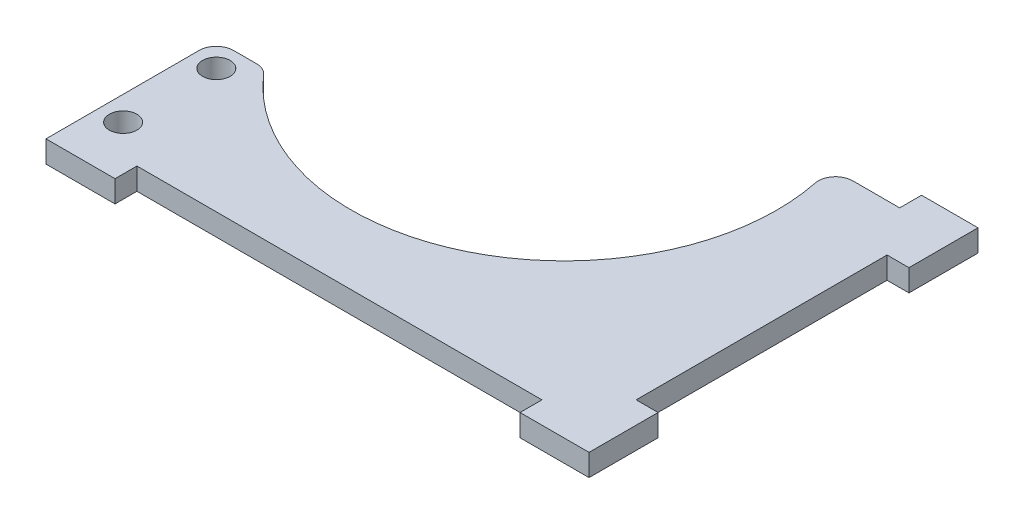
ISO-10303-21;
HEADER;
FILE_DESCRIPTION(('STEP AP214'),'2;1');
FILE_NAME('part.step','',(''),(''),'','','');
FILE_SCHEMA(('AUTOMOTIVE_DESIGN { 1 0 10303 214 1 1 1 1 }'));
ENDSEC;
DATA;
#1=APPLICATION_CONTEXT('core data for automotive mechanical design processes');
#2=APPLICATION_PROTOCOL_DEFINITION('international standard','automotive_design',2000,#1);
#3=PRODUCT_CONTEXT('',#1,'mechanical');
#4=PRODUCT('Part','Part','',(#3));
#5=PRODUCT_RELATED_PRODUCT_CATEGORY('part','',(#4));
#6=PRODUCT_DEFINITION_FORMATION('','',#4);
#7=PRODUCT_DEFINITION_CONTEXT('part definition',#1,'design');
#8=PRODUCT_DEFINITION('design','',#6,#7);
#9=PRODUCT_DEFINITION_SHAPE('','',#8);
#10=(LENGTH_UNIT() NAMED_UNIT(*) SI_UNIT(.MILLI.,.METRE.));
#11=(NAMED_UNIT(*) PLANE_ANGLE_UNIT() SI_UNIT($,.RADIAN.));
#12=(NAMED_UNIT(*) SI_UNIT($,.STERADIAN.) SOLID_ANGLE_UNIT());
#13=UNCERTAINTY_MEASURE_WITH_UNIT(LENGTH_MEASURE(1.E-05),#10,'distance_accuracy_value','');
#14=(GEOMETRIC_REPRESENTATION_CONTEXT(3) GLOBAL_UNCERTAINTY_ASSIGNED_CONTEXT((#13)) GLOBAL_UNIT_ASSIGNED_CONTEXT((#10,
#11,#12)) REPRESENTATION_CONTEXT('',''));
#15=CARTESIAN_POINT('',(0.,0.,0.));
#16=DIRECTION('',(0.,0.,1.));
#17=DIRECTION('',(1.,0.,0.));
#18=AXIS2_PLACEMENT_3D('',#15,#16,#17);
#19=CARTESIAN_POINT('',(-16.6150812627034,3.175,-31.712082370338));
#20=DIRECTION('',(0.,1.,0.));
#21=DIRECTION('',(0.,0.,1.));
#22=AXIS2_PLACEMENT_3D('',#19,#20,#21);
#23=PLANE('',#22);
#24=CARTESIAN_POINT('',(-71.675,3.175,40.9999999999997));
#25=DIRECTION('',(0.,1.,0.));
#26=DIRECTION('',(0.,0.,1.));
#27=AXIS2_PLACEMENT_3D('',#24,#25,#26);
#28=CIRCLE('',#27,4.00000000000001);
#29=CARTESIAN_POINT('',(-71.675,3.175,44.9999999999997));
#30=VERTEX_POINT('',#29);
#31=EDGE_CURVE('E369',#30,#30,#28,.T.);
#32=ORIENTED_EDGE('',*,*,#31,.F.);
#33=EDGE_LOOP('',(#32));
#34=FACE_BOUND('',#33,.T.);
#35=DIRECTION('',(-1.,0.,0.));
#36=VECTOR('',#35,1.);
#37=CARTESIAN_POINT('',(62.325,3.175,-50.));
#38=LINE('',#37,#36);
#39=CARTESIAN_POINT('',(62.325,3.175,-50.));
#40=VERTEX_POINT('',#39);
#41=CARTESIAN_POINT('',(48.7602441992328,3.175,-50.));
#42=VERTEX_POINT('',#41);
#43=EDGE_CURVE('E355',#40,#42,#38,.T.);
#44=ORIENTED_EDGE('',*,*,#43,.T.);
#45=CARTESIAN_POINT('',(48.7602441992328,3.175,-45.));
#46=DIRECTION('',(0.,1.,0.));
#47=DIRECTION('',(0.,0.,1.));
#48=AXIS2_PLACEMENT_3D('',#45,#46,#47);
#49=CIRCLE('',#48,5.);
#50=CARTESIAN_POINT('',(43.8604327153835,3.175,-44.0040846307347));
#51=VERTEX_POINT('',#50);
#52=EDGE_CURVE('E228',#42,#51,#49,.T.);
#53=ORIENTED_EDGE('',*,*,#52,.T.);
#54=CARTESIAN_POINT('',(-16.6150812627034,3.175,-31.712082370338));
#55=DIRECTION('',(0.,-1.,0.));
#56=DIRECTION('',(0.,0.,1.));
#57=AXIS2_PLACEMENT_3D('',#54,#55,#56);
#58=CIRCLE('',#57,61.712082370338);
#59=CARTESIAN_POINT('',(-63.2339449505367,3.175,8.72382566866376));
#60=VERTEX_POINT('',#59);
#61=EDGE_CURVE('E354',#51,#60,#58,.T.);
#62=ORIENTED_EDGE('',*,*,#61,.T.);
#63=CARTESIAN_POINT('',(-67.0110710737544,3.175,12.));
#64=DIRECTION('',(0.,1.,0.));
#65=DIRECTION('',(0.,0.,1.));
#66=AXIS2_PLACEMENT_3D('',#63,#64,#65);
#67=CIRCLE('',#66,5.);
#68=CARTESIAN_POINT('',(-67.0110710737544,3.175,7.));
#69=VERTEX_POINT('',#68);
#70=EDGE_CURVE('E60',#60,#69,#67,.T.);
#71=ORIENTED_EDGE('',*,*,#70,.T.);
#72=DIRECTION('',(-1.,0.,0.));
#73=VECTOR('',#72,1.);
#74=CARTESIAN_POINT('',(-78.675,3.175,7.));
#75=LINE('',#74,#73);
#76=CARTESIAN_POINT('',(-73.675,3.175,7.));
#77=VERTEX_POINT('',#76);
#78=EDGE_CURVE('E238',#69,#77,#75,.T.);
#79=ORIENTED_EDGE('',*,*,#78,.T.);
#80=CARTESIAN_POINT('',(-73.675,3.175,12.));
#81=DIRECTION('',(0.,1.,0.));
#82=DIRECTION('',(0.,0.,1.));
#83=AXIS2_PLACEMENT_3D('',#80,#81,#82);
#84=CIRCLE('',#83,5.);
#85=CARTESIAN_POINT('',(-78.675,3.175,12.));
#86=VERTEX_POINT('',#85);
#87=EDGE_CURVE('E176',#77,#86,#84,.T.);
#88=ORIENTED_EDGE('',*,*,#87,.T.);
#89=DIRECTION('',(0.,0.,1.));
#90=VECTOR('',#89,1.);
#91=CARTESIAN_POINT('',(-78.675,3.175,56.35));
#92=LINE('',#91,#90);
#93=CARTESIAN_POINT('',(-78.675,3.175,56.35));
#94=VERTEX_POINT('',#93);
#95=EDGE_CURVE('E169',#86,#94,#92,.T.);
#96=ORIENTED_EDGE('',*,*,#95,.T.);
#97=DIRECTION('',(1.,0.,0.));
#98=VECTOR('',#97,1.);
#99=CARTESIAN_POINT('',(-78.675,3.175,56.35));
#100=LINE('',#99,#98);
#101=CARTESIAN_POINT('',(-58.675,3.175,56.35));
#102=VERTEX_POINT('',#101);
#103=EDGE_CURVE('E173',#94,#102,#100,.T.);
#104=ORIENTED_EDGE('',*,*,#103,.T.);
#105=DIRECTION('',(0.,0.,-1.));
#106=VECTOR('',#105,1.);
#107=CARTESIAN_POINT('',(-58.675,3.175,56.35));
#108=LINE('',#107,#106);
#109=CARTESIAN_POINT('',(-58.675,3.175,50.));
#110=VERTEX_POINT('',#109);
#111=EDGE_CURVE('E192',#102,#110,#108,.T.);
#112=ORIENTED_EDGE('',*,*,#111,.T.);
#113=DIRECTION('',(1.,0.,0.));
#114=VECTOR('',#113,1.);
#115=CARTESIAN_POINT('',(-58.675,3.175,50.));
#116=LINE('',#115,#114);
#117=CARTESIAN_POINT('',(58.675,3.175,50.));
#118=VERTEX_POINT('',#117);
#119=EDGE_CURVE('E301',#110,#118,#116,.T.);
#120=ORIENTED_EDGE('',*,*,#119,.T.);
#121=DIRECTION('',(0.,0.,1.));
#122=VECTOR('',#121,1.);
#123=CARTESIAN_POINT('',(58.675,3.175,50.));
#124=LINE('',#123,#122);
#125=CARTESIAN_POINT('',(58.675,3.175,56.35));
#126=VERTEX_POINT('',#125);
#127=EDGE_CURVE('E375',#118,#126,#124,.T.);
#128=ORIENTED_EDGE('',*,*,#127,.T.);
#129=DIRECTION('',(1.,0.,0.));
#130=VECTOR('',#129,1.);
#131=CARTESIAN_POINT('',(58.675,3.175,56.35));
#132=LINE('',#131,#130);
#133=CARTESIAN_POINT('',(78.675,3.175,56.35));
#134=VERTEX_POINT('',#133);
#135=EDGE_CURVE('E380',#126,#134,#132,.T.);
#136=ORIENTED_EDGE('',*,*,#135,.T.);
#137=DIRECTION('',(0.,0.,-1.));
#138=VECTOR('',#137,1.);
#139=CARTESIAN_POINT('',(78.675,3.175,56.35));
#140=LINE('',#139,#138);
#141=CARTESIAN_POINT('',(78.675,3.175,36.35));
#142=VERTEX_POINT('',#141);
#143=EDGE_CURVE('E383',#134,#142,#140,.T.);
#144=ORIENTED_EDGE('',*,*,#143,.T.);
#145=DIRECTION('',(-1.,0.,0.));
#146=VECTOR('',#145,1.);
#147=CARTESIAN_POINT('',(78.675,3.175,36.35));
#148=LINE('',#147,#146);
#149=CARTESIAN_POINT('',(72.325,3.175,36.35));
#150=VERTEX_POINT('',#149);
#151=EDGE_CURVE('E386',#142,#150,#148,.T.);
#152=ORIENTED_EDGE('',*,*,#151,.T.);
#153=DIRECTION('',(0.,0.,-1.));
#154=VECTOR('',#153,1.);
#155=CARTESIAN_POINT('',(72.325,3.175,36.35));
#156=LINE('',#155,#154);
#157=CARTESIAN_POINT('',(72.325,3.175,-36.35));
#158=VERTEX_POINT('',#157);
#159=EDGE_CURVE('E389',#150,#158,#156,.T.);
#160=ORIENTED_EDGE('',*,*,#159,.T.);
#161=DIRECTION('',(1.,0.,0.));
#162=VECTOR('',#161,1.);
#163=CARTESIAN_POINT('',(72.325,3.175,-36.35));
#164=LINE('',#163,#162);
#165=CARTESIAN_POINT('',(78.675,3.175,-36.35));
#166=VERTEX_POINT('',#165);
#167=EDGE_CURVE('E392',#158,#166,#164,.T.);
#168=ORIENTED_EDGE('',*,*,#167,.T.);
#169=DIRECTION('',(0.,0.,-1.));
#170=VECTOR('',#169,1.);
#171=CARTESIAN_POINT('',(78.675,3.175,-36.35));
#172=LINE('',#171,#170);
#173=CARTESIAN_POINT('',(78.675,3.175,-56.35));
#174=VERTEX_POINT('',#173);
#175=EDGE_CURVE('E395',#166,#174,#172,.T.);
#176=ORIENTED_EDGE('',*,*,#175,.T.);
#177=DIRECTION('',(-1.,0.,0.));
#178=VECTOR('',#177,1.);
#179=CARTESIAN_POINT('',(78.675,3.175,-56.35));
#180=LINE('',#179,#178);
#181=CARTESIAN_POINT('',(62.325,3.175,-56.35));
#182=VERTEX_POINT('',#181);
#183=EDGE_CURVE('E398',#174,#182,#180,.T.);
#184=ORIENTED_EDGE('',*,*,#183,.T.);
#185=DIRECTION('',(0.,0.,1.));
#186=VECTOR('',#185,1.);
#187=CARTESIAN_POINT('',(62.325,3.175,-56.35));
#188=LINE('',#187,#186);
#189=EDGE_CURVE('E364',#182,#40,#188,.T.);
#190=ORIENTED_EDGE('',*,*,#189,.T.);
#191=EDGE_LOOP('',(#44,#53,#62,#71,#79,#88,#96,#104,#112,#120,#128,#136,#144,#152,#160,#168,
#176,#184,#190));
#192=FACE_BOUND('',#191,.T.);
#193=CARTESIAN_POINT('',(-71.675,3.175,13.9999999999997));
#194=DIRECTION('',(0.,1.,0.));
#195=DIRECTION('',(0.,0.,1.));
#196=AXIS2_PLACEMENT_3D('',#193,#194,#195);
#197=CIRCLE('',#196,4.00000000000001);
#198=CARTESIAN_POINT('',(-71.675,3.175,17.9999999999997));
#199=VERTEX_POINT('',#198);
#200=EDGE_CURVE('E635',#199,#199,#197,.T.);
#201=ORIENTED_EDGE('',*,*,#200,.F.);
#202=EDGE_LOOP('',(#201));
#203=FACE_BOUND('',#202,.T.);
#204=ADVANCED_FACE('F39',(#34,#192,#203),#23,.T.);
#205=CARTESIAN_POINT('',(-16.6150812627034,-3.175,-31.712082370338));
#206=DIRECTION('',(0.,1.,0.));
#207=DIRECTION('',(0.,0.,1.));
#208=AXIS2_PLACEMENT_3D('',#205,#206,#207);
#209=PLANE('',#208);
#210=CARTESIAN_POINT('',(-16.6150812627034,-3.175,-31.712082370338));
#211=DIRECTION('',(0.,-1.,0.));
#212=DIRECTION('',(0.,0.,1.));
#213=AXIS2_PLACEMENT_3D('',#210,#211,#212);
#214=CIRCLE('',#213,61.712082370338);
#215=CARTESIAN_POINT('',(43.8604327153835,-3.175,-44.0040846307347));
#216=VERTEX_POINT('',#215);
#217=CARTESIAN_POINT('',(-63.2339449505367,-3.175,8.72382566866376));
#218=VERTEX_POINT('',#217);
#219=EDGE_CURVE('E246',#216,#218,#214,.T.);
#220=ORIENTED_EDGE('',*,*,#219,.F.);
#221=CARTESIAN_POINT('',(48.7602441992328,-3.175,-45.));
#222=DIRECTION('',(0.,1.,0.));
#223=DIRECTION('',(0.,0.,1.));
#224=AXIS2_PLACEMENT_3D('',#221,#222,#223);
#225=CIRCLE('',#224,5.);
#226=CARTESIAN_POINT('',(48.7602441992328,-3.175,-50.));
#227=VERTEX_POINT('',#226);
#228=EDGE_CURVE('E218',#216,#227,#225,.F.);
#229=ORIENTED_EDGE('',*,*,#228,.T.);
#230=DIRECTION('',(-1.,0.,0.));
#231=VECTOR('',#230,1.);
#232=CARTESIAN_POINT('',(62.325,-3.175,-50.));
#233=LINE('',#232,#231);
#234=CARTESIAN_POINT('',(62.325,-3.175,-50.));
#235=VERTEX_POINT('',#234);
#236=EDGE_CURVE('E249',#235,#227,#233,.T.);
#237=ORIENTED_EDGE('',*,*,#236,.F.);
#238=DIRECTION('',(0.,0.,1.));
#239=VECTOR('',#238,1.);
#240=CARTESIAN_POINT('',(62.325,-3.175,-56.35));
#241=LINE('',#240,#239);
#242=CARTESIAN_POINT('',(62.325,-3.175,-56.35));
#243=VERTEX_POINT('',#242);
#244=EDGE_CURVE('E338',#243,#235,#241,.T.);
#245=ORIENTED_EDGE('',*,*,#244,.F.);
#246=DIRECTION('',(-1.,0.,0.));
#247=VECTOR('',#246,1.);
#248=CARTESIAN_POINT('',(78.675,-3.175,-56.35));
#249=LINE('',#248,#247);
#250=CARTESIAN_POINT('',(78.675,-3.175,-56.35));
#251=VERTEX_POINT('',#250);
#252=EDGE_CURVE('E335',#251,#243,#249,.T.);
#253=ORIENTED_EDGE('',*,*,#252,.F.);
#254=DIRECTION('',(0.,0.,-1.));
#255=VECTOR('',#254,1.);
#256=CARTESIAN_POINT('',(78.675,-3.175,-36.35));
#257=LINE('',#256,#255);
#258=CARTESIAN_POINT('',(78.675,-3.175,-36.35));
#259=VERTEX_POINT('',#258);
#260=EDGE_CURVE('E332',#259,#251,#257,.T.);
#261=ORIENTED_EDGE('',*,*,#260,.F.);
#262=DIRECTION('',(1.,0.,0.));
#263=VECTOR('',#262,1.);
#264=CARTESIAN_POINT('',(72.325,-3.175,-36.35));
#265=LINE('',#264,#263);
#266=CARTESIAN_POINT('',(72.325,-3.175,-36.35));
#267=VERTEX_POINT('',#266);
#268=EDGE_CURVE('E329',#267,#259,#265,.T.);
#269=ORIENTED_EDGE('',*,*,#268,.F.);
#270=DIRECTION('',(0.,0.,-1.));
#271=VECTOR('',#270,1.);
#272=CARTESIAN_POINT('',(72.325,-3.175,36.35));
#273=LINE('',#272,#271);
#274=CARTESIAN_POINT('',(72.325,-3.175,36.35));
#275=VERTEX_POINT('',#274);
#276=EDGE_CURVE('E326',#275,#267,#273,.T.);
#277=ORIENTED_EDGE('',*,*,#276,.F.);
#278=DIRECTION('',(-1.,0.,0.));
#279=VECTOR('',#278,1.);
#280=CARTESIAN_POINT('',(78.675,-3.175,36.35));
#281=LINE('',#280,#279);
#282=CARTESIAN_POINT('',(78.675,-3.175,36.35));
#283=VERTEX_POINT('',#282);
#284=EDGE_CURVE('E323',#283,#275,#281,.T.);
#285=ORIENTED_EDGE('',*,*,#284,.F.);
#286=DIRECTION('',(0.,0.,-1.));
#287=VECTOR('',#286,1.);
#288=CARTESIAN_POINT('',(78.675,-3.175,56.35));
#289=LINE('',#288,#287);
#290=CARTESIAN_POINT('',(78.675,-3.175,56.35));
#291=VERTEX_POINT('',#290);
#292=EDGE_CURVE('E320',#291,#283,#289,.T.);
#293=ORIENTED_EDGE('',*,*,#292,.F.);
#294=DIRECTION('',(1.,0.,0.));
#295=VECTOR('',#294,1.);
#296=CARTESIAN_POINT('',(58.675,-3.175,56.35));
#297=LINE('',#296,#295);
#298=CARTESIAN_POINT('',(58.675,-3.175,56.35));
#299=VERTEX_POINT('',#298);
#300=EDGE_CURVE('E312',#299,#291,#297,.T.);
#301=ORIENTED_EDGE('',*,*,#300,.F.);
#302=DIRECTION('',(0.,0.,1.));
#303=VECTOR('',#302,1.);
#304=CARTESIAN_POINT('',(58.675,-3.175,50.));
#305=LINE('',#304,#303);
#306=CARTESIAN_POINT('',(58.675,-3.175,50.));
#307=VERTEX_POINT('',#306);
#308=EDGE_CURVE('E307',#307,#299,#305,.T.);
#309=ORIENTED_EDGE('',*,*,#308,.F.);
#310=DIRECTION('',(1.,0.,0.));
#311=VECTOR('',#310,1.);
#312=CARTESIAN_POINT('',(-58.675,-3.175,50.));
#313=LINE('',#312,#311);
#314=CARTESIAN_POINT('',(-58.675,-3.175,50.));
#315=VERTEX_POINT('',#314);
#316=EDGE_CURVE('E300',#315,#307,#313,.T.);
#317=ORIENTED_EDGE('',*,*,#316,.F.);
#318=DIRECTION('',(0.,0.,-1.));
#319=VECTOR('',#318,1.);
#320=CARTESIAN_POINT('',(-58.675,-3.175,56.35));
#321=LINE('',#320,#319);
#322=CARTESIAN_POINT('',(-58.675,-3.175,56.35));
#323=VERTEX_POINT('',#322);
#324=EDGE_CURVE('E305',#323,#315,#321,.T.);
#325=ORIENTED_EDGE('',*,*,#324,.F.);
#326=DIRECTION('',(1.,0.,0.));
#327=VECTOR('',#326,1.);
#328=CARTESIAN_POINT('',(-78.675,-3.175,56.35));
#329=LINE('',#328,#327);
#330=CARTESIAN_POINT('',(-78.675,-3.175,56.35));
#331=VERTEX_POINT('',#330);
#332=EDGE_CURVE('E314',#331,#323,#329,.T.);
#333=ORIENTED_EDGE('',*,*,#332,.F.);
#334=DIRECTION('',(0.,0.,1.));
#335=VECTOR('',#334,1.);
#336=CARTESIAN_POINT('',(-78.675,-3.175,56.35));
#337=LINE('',#336,#335);
#338=CARTESIAN_POINT('',(-78.675,-3.175,12.));
#339=VERTEX_POINT('',#338);
#340=EDGE_CURVE('E196',#339,#331,#337,.T.);
#341=ORIENTED_EDGE('',*,*,#340,.F.);
#342=CARTESIAN_POINT('',(-73.675,-3.175,12.));
#343=DIRECTION('',(0.,1.,0.));
#344=DIRECTION('',(0.,0.,1.));
#345=AXIS2_PLACEMENT_3D('',#342,#343,#344);
#346=CIRCLE('',#345,5.);
#347=CARTESIAN_POINT('',(-73.675,-3.175,7.));
#348=VERTEX_POINT('',#347);
#349=EDGE_CURVE('E215',#339,#348,#346,.F.);
#350=ORIENTED_EDGE('',*,*,#349,.T.);
#351=DIRECTION('',(-1.,0.,0.));
#352=VECTOR('',#351,1.);
#353=CARTESIAN_POINT('',(-78.675,-3.175,7.));
#354=LINE('',#353,#352);
#355=CARTESIAN_POINT('',(-67.0110710737544,-3.175,7.));
#356=VERTEX_POINT('',#355);
#357=EDGE_CURVE('E182',#356,#348,#354,.T.);
#358=ORIENTED_EDGE('',*,*,#357,.F.);
#359=CARTESIAN_POINT('',(-67.0110710737544,-3.175,12.));
#360=DIRECTION('',(0.,1.,0.));
#361=DIRECTION('',(0.,0.,1.));
#362=AXIS2_PLACEMENT_3D('',#359,#360,#361);
#363=CIRCLE('',#362,5.);
#364=EDGE_CURVE('E212',#356,#218,#363,.F.);
#365=ORIENTED_EDGE('',*,*,#364,.T.);
#366=EDGE_LOOP('',(#220,#229,#237,#245,#253,#261,#269,#277,#285,#293,#301,#309,#317,#325,#333,
#341,#350,#358,#365));
#367=FACE_BOUND('',#366,.T.);
#368=CARTESIAN_POINT('',(-71.675,-3.175,40.9999999999997));
#369=DIRECTION('',(0.,1.,0.));
#370=DIRECTION('',(0.,0.,1.));
#371=AXIS2_PLACEMENT_3D('',#368,#369,#370);
#372=CIRCLE('',#371,4.00000000000001);
#373=CARTESIAN_POINT('',(-71.675,-3.175,44.9999999999997));
#374=VERTEX_POINT('',#373);
#375=EDGE_CURVE('E643',#374,#374,#372,.T.);
#376=ORIENTED_EDGE('',*,*,#375,.T.);
#377=EDGE_LOOP('',(#376));
#378=FACE_BOUND('',#377,.T.);
#379=CARTESIAN_POINT('',(-71.675,-3.175,13.9999999999997));
#380=DIRECTION('',(0.,1.,0.));
#381=DIRECTION('',(0.,0.,1.));
#382=AXIS2_PLACEMENT_3D('',#379,#380,#381);
#383=CIRCLE('',#382,4.00000000000001);
#384=CARTESIAN_POINT('',(-71.675,-3.175,17.9999999999997));
#385=VERTEX_POINT('',#384);
#386=EDGE_CURVE('E638',#385,#385,#383,.T.);
#387=ORIENTED_EDGE('',*,*,#386,.T.);
#388=EDGE_LOOP('',(#387));
#389=FACE_BOUND('',#388,.T.);
#390=ADVANCED_FACE('F242',(#367,#378,#389),#209,.F.);
#391=CARTESIAN_POINT('',(-78.675,3.175,56.35));
#392=DIRECTION('',(1.,0.,0.));
#393=DIRECTION('',(0.,0.,-1.));
#394=AXIS2_PLACEMENT_3D('',#391,#392,#393);
#395=PLANE('',#394);
#396=ORIENTED_EDGE('',*,*,#95,.F.);
#397=DIRECTION('',(0.,-1.,0.));
#398=VECTOR('',#397,1.);
#399=CARTESIAN_POINT('',(-78.675,3.175,12.));
#400=LINE('',#399,#398);
#401=EDGE_CURVE('E231',#86,#339,#400,.T.);
#402=ORIENTED_EDGE('',*,*,#401,.T.);
#403=ORIENTED_EDGE('',*,*,#340,.T.);
#404=DIRECTION('',(0.,-1.,0.));
#405=VECTOR('',#404,1.);
#406=CARTESIAN_POINT('',(-78.675,3.175,56.35));
#407=LINE('',#406,#405);
#408=EDGE_CURVE('E187',#94,#331,#407,.T.);
#409=ORIENTED_EDGE('',*,*,#408,.F.);
#410=EDGE_LOOP('',(#396,#402,#403,#409));
#411=FACE_BOUND('',#410,.T.);
#412=ADVANCED_FACE('F194',(#411),#395,.F.);
#413=CARTESIAN_POINT('',(-78.675,3.175,56.35));
#414=DIRECTION('',(0.,0.,-1.));
#415=DIRECTION('',(-1.,0.,0.));
#416=AXIS2_PLACEMENT_3D('',#413,#414,#415);
#417=PLANE('',#416);
#418=ORIENTED_EDGE('',*,*,#332,.T.);
#419=DIRECTION('',(0.,-1.,0.));
#420=VECTOR('',#419,1.);
#421=CARTESIAN_POINT('',(-58.675,3.175,56.35));
#422=LINE('',#421,#420);
#423=EDGE_CURVE('E189',#102,#323,#422,.T.);
#424=ORIENTED_EDGE('',*,*,#423,.F.);
#425=ORIENTED_EDGE('',*,*,#103,.F.);
#426=ORIENTED_EDGE('',*,*,#408,.T.);
#427=EDGE_LOOP('',(#418,#424,#425,#426));
#428=FACE_BOUND('',#427,.T.);
#429=ADVANCED_FACE('F186',(#428),#417,.F.);
#430=CARTESIAN_POINT('',(-58.675,3.175,56.35));
#431=DIRECTION('',(-1.,0.,0.));
#432=DIRECTION('',(0.,0.,1.));
#433=AXIS2_PLACEMENT_3D('',#430,#431,#432);
#434=PLANE('',#433);
#435=ORIENTED_EDGE('',*,*,#324,.T.);
#436=DIRECTION('',(0.,-1.,0.));
#437=VECTOR('',#436,1.);
#438=CARTESIAN_POINT('',(-58.675,3.175,50.));
#439=LINE('',#438,#437);
#440=EDGE_CURVE('E205',#110,#315,#439,.T.);
#441=ORIENTED_EDGE('',*,*,#440,.F.);
#442=ORIENTED_EDGE('',*,*,#111,.F.);
#443=ORIENTED_EDGE('',*,*,#423,.T.);
#444=EDGE_LOOP('',(#435,#441,#442,#443));
#445=FACE_BOUND('',#444,.T.);
#446=ADVANCED_FACE('F371',(#445),#434,.F.);
#447=CARTESIAN_POINT('',(-58.675,3.175,50.));
#448=DIRECTION('',(0.,0.,-1.));
#449=DIRECTION('',(-1.,0.,0.));
#450=AXIS2_PLACEMENT_3D('',#447,#448,#449);
#451=PLANE('',#450);
#452=ORIENTED_EDGE('',*,*,#316,.T.);
#453=DIRECTION('',(0.,-1.,0.));
#454=VECTOR('',#453,1.);
#455=CARTESIAN_POINT('',(58.675,3.175,50.));
#456=LINE('',#455,#454);
#457=EDGE_CURVE('E289',#118,#307,#456,.T.);
#458=ORIENTED_EDGE('',*,*,#457,.F.);
#459=ORIENTED_EDGE('',*,*,#119,.F.);
#460=ORIENTED_EDGE('',*,*,#440,.T.);
#461=EDGE_LOOP('',(#452,#458,#459,#460));
#462=FACE_BOUND('',#461,.T.);
#463=ADVANCED_FACE('F298',(#462),#451,.F.);
#464=CARTESIAN_POINT('',(58.675,3.175,50.));
#465=DIRECTION('',(1.,0.,0.));
#466=DIRECTION('',(0.,0.,-1.));
#467=AXIS2_PLACEMENT_3D('',#464,#465,#466);
#468=PLANE('',#467);
#469=ORIENTED_EDGE('',*,*,#308,.T.);
#470=DIRECTION('',(0.,-1.,0.));
#471=VECTOR('',#470,1.);
#472=CARTESIAN_POINT('',(58.675,3.175,56.35));
#473=LINE('',#472,#471);
#474=EDGE_CURVE('E285',#126,#299,#473,.T.);
#475=ORIENTED_EDGE('',*,*,#474,.F.);
#476=ORIENTED_EDGE('',*,*,#127,.F.);
#477=ORIENTED_EDGE('',*,*,#457,.T.);
#478=EDGE_LOOP('',(#469,#475,#476,#477));
#479=FACE_BOUND('',#478,.T.);
#480=ADVANCED_FACE('F441',(#479),#468,.F.);
#481=CARTESIAN_POINT('',(58.675,3.175,56.35));
#482=DIRECTION('',(0.,0.,-1.));
#483=DIRECTION('',(-1.,0.,0.));
#484=AXIS2_PLACEMENT_3D('',#481,#482,#483);
#485=PLANE('',#484);
#486=ORIENTED_EDGE('',*,*,#300,.T.);
#487=DIRECTION('',(0.,-1.,0.));
#488=VECTOR('',#487,1.);
#489=CARTESIAN_POINT('',(78.675,3.175,56.35));
#490=LINE('',#489,#488);
#491=EDGE_CURVE('E281',#134,#291,#490,.T.);
#492=ORIENTED_EDGE('',*,*,#491,.F.);
#493=ORIENTED_EDGE('',*,*,#135,.F.);
#494=ORIENTED_EDGE('',*,*,#474,.T.);
#495=EDGE_LOOP('',(#486,#492,#493,#494));
#496=FACE_BOUND('',#495,.T.);
#497=ADVANCED_FACE('F436',(#496),#485,.F.);
#498=CARTESIAN_POINT('',(78.675,3.175,56.35));
#499=DIRECTION('',(-1.,0.,0.));
#500=DIRECTION('',(0.,0.,1.));
#501=AXIS2_PLACEMENT_3D('',#498,#499,#500);
#502=PLANE('',#501);
#503=ORIENTED_EDGE('',*,*,#292,.T.);
#504=DIRECTION('',(0.,-1.,0.));
#505=VECTOR('',#504,1.);
#506=CARTESIAN_POINT('',(78.675,3.175,36.35));
#507=LINE('',#506,#505);
#508=EDGE_CURVE('E277',#142,#283,#507,.T.);
#509=ORIENTED_EDGE('',*,*,#508,.F.);
#510=ORIENTED_EDGE('',*,*,#143,.F.);
#511=ORIENTED_EDGE('',*,*,#491,.T.);
#512=EDGE_LOOP('',(#503,#509,#510,#511));
#513=FACE_BOUND('',#512,.T.);
#514=ADVANCED_FACE('F433',(#513),#502,.F.);
#515=CARTESIAN_POINT('',(78.675,3.175,36.35));
#516=DIRECTION('',(0.,0.,1.));
#517=DIRECTION('',(1.,0.,0.));
#518=AXIS2_PLACEMENT_3D('',#515,#516,#517);
#519=PLANE('',#518);
#520=ORIENTED_EDGE('',*,*,#284,.T.);
#521=DIRECTION('',(0.,-1.,0.));
#522=VECTOR('',#521,1.);
#523=CARTESIAN_POINT('',(72.325,3.175,36.35));
#524=LINE('',#523,#522);
#525=EDGE_CURVE('E273',#150,#275,#524,.T.);
#526=ORIENTED_EDGE('',*,*,#525,.F.);
#527=ORIENTED_EDGE('',*,*,#151,.F.);
#528=ORIENTED_EDGE('',*,*,#508,.T.);
#529=EDGE_LOOP('',(#520,#526,#527,#528));
#530=FACE_BOUND('',#529,.T.);
#531=ADVANCED_FACE('F429',(#530),#519,.F.);
#532=CARTESIAN_POINT('',(72.325,3.175,36.35));
#533=DIRECTION('',(-1.,0.,0.));
#534=DIRECTION('',(0.,0.,1.));
#535=AXIS2_PLACEMENT_3D('',#532,#533,#534);
#536=PLANE('',#535);
#537=ORIENTED_EDGE('',*,*,#276,.T.);
#538=DIRECTION('',(0.,-1.,0.));
#539=VECTOR('',#538,1.);
#540=CARTESIAN_POINT('',(72.325,3.175,-36.35));
#541=LINE('',#540,#539);
#542=EDGE_CURVE('E269',#158,#267,#541,.T.);
#543=ORIENTED_EDGE('',*,*,#542,.F.);
#544=ORIENTED_EDGE('',*,*,#159,.F.);
#545=ORIENTED_EDGE('',*,*,#525,.T.);
#546=EDGE_LOOP('',(#537,#543,#544,#545));
#547=FACE_BOUND('',#546,.T.);
#548=ADVANCED_FACE('F424',(#547),#536,.F.);
#549=CARTESIAN_POINT('',(72.325,3.175,-36.35));
#550=DIRECTION('',(0.,0.,-1.));
#551=DIRECTION('',(-1.,0.,0.));
#552=AXIS2_PLACEMENT_3D('',#549,#550,#551);
#553=PLANE('',#552);
#554=ORIENTED_EDGE('',*,*,#268,.T.);
#555=DIRECTION('',(0.,-1.,0.));
#556=VECTOR('',#555,1.);
#557=CARTESIAN_POINT('',(78.675,3.175,-36.35));
#558=LINE('',#557,#556);
#559=EDGE_CURVE('E265',#166,#259,#558,.T.);
#560=ORIENTED_EDGE('',*,*,#559,.F.);
#561=ORIENTED_EDGE('',*,*,#167,.F.);
#562=ORIENTED_EDGE('',*,*,#542,.T.);
#563=EDGE_LOOP('',(#554,#560,#561,#562));
#564=FACE_BOUND('',#563,.T.);
#565=ADVANCED_FACE('F418',(#564),#553,.F.);
#566=CARTESIAN_POINT('',(78.675,3.175,-36.35));
#567=DIRECTION('',(-1.,0.,0.));
#568=DIRECTION('',(0.,0.,1.));
#569=AXIS2_PLACEMENT_3D('',#566,#567,#568);
#570=PLANE('',#569);
#571=ORIENTED_EDGE('',*,*,#260,.T.);
#572=DIRECTION('',(0.,-1.,0.));
#573=VECTOR('',#572,1.);
#574=CARTESIAN_POINT('',(78.675,3.175,-56.35));
#575=LINE('',#574,#573);
#576=EDGE_CURVE('E261',#174,#251,#575,.T.);
#577=ORIENTED_EDGE('',*,*,#576,.F.);
#578=ORIENTED_EDGE('',*,*,#175,.F.);
#579=ORIENTED_EDGE('',*,*,#559,.T.);
#580=EDGE_LOOP('',(#571,#577,#578,#579));
#581=FACE_BOUND('',#580,.T.);
#582=ADVANCED_FACE('F414',(#581),#570,.F.);
#583=CARTESIAN_POINT('',(78.675,3.175,-56.35));
#584=DIRECTION('',(0.,0.,1.));
#585=DIRECTION('',(1.,0.,0.));
#586=AXIS2_PLACEMENT_3D('',#583,#584,#585);
#587=PLANE('',#586);
#588=ORIENTED_EDGE('',*,*,#252,.T.);
#589=DIRECTION('',(0.,-1.,0.));
#590=VECTOR('',#589,1.);
#591=CARTESIAN_POINT('',(62.325,3.175,-56.35));
#592=LINE('',#591,#590);
#593=EDGE_CURVE('E257',#182,#243,#592,.T.);
#594=ORIENTED_EDGE('',*,*,#593,.F.);
#595=ORIENTED_EDGE('',*,*,#183,.F.);
#596=ORIENTED_EDGE('',*,*,#576,.T.);
#597=EDGE_LOOP('',(#588,#594,#595,#596));
#598=FACE_BOUND('',#597,.T.);
#599=ADVANCED_FACE('F410',(#598),#587,.F.);
#600=CARTESIAN_POINT('',(62.325,3.175,-56.35));
#601=DIRECTION('',(1.,0.,0.));
#602=DIRECTION('',(0.,0.,-1.));
#603=AXIS2_PLACEMENT_3D('',#600,#601,#602);
#604=PLANE('',#603);
#605=ORIENTED_EDGE('',*,*,#244,.T.);
#606=DIRECTION('',(0.,-1.,0.));
#607=VECTOR('',#606,1.);
#608=CARTESIAN_POINT('',(62.325,3.175,-50.));
#609=LINE('',#608,#607);
#610=EDGE_CURVE('E253',#40,#235,#609,.T.);
#611=ORIENTED_EDGE('',*,*,#610,.F.);
#612=ORIENTED_EDGE('',*,*,#189,.F.);
#613=ORIENTED_EDGE('',*,*,#593,.T.);
#614=EDGE_LOOP('',(#605,#611,#612,#613));
#615=FACE_BOUND('',#614,.T.);
#616=ADVANCED_FACE('F405',(#615),#604,.F.);
#617=CARTESIAN_POINT('',(62.325,3.175,-50.));
#618=DIRECTION('',(0.,0.,1.));
#619=DIRECTION('',(1.,0.,0.));
#620=AXIS2_PLACEMENT_3D('',#617,#618,#619);
#621=PLANE('',#620);
#622=ORIENTED_EDGE('',*,*,#236,.T.);
#623=DIRECTION('',(0.,-1.,0.));
#624=VECTOR('',#623,1.);
#625=CARTESIAN_POINT('',(48.7602441992328,3.175,-50.));
#626=LINE('',#625,#624);
#627=EDGE_CURVE('E221',#227,#42,#626,.F.);
#628=ORIENTED_EDGE('',*,*,#627,.T.);
#629=ORIENTED_EDGE('',*,*,#43,.F.);
#630=ORIENTED_EDGE('',*,*,#610,.T.);
#631=EDGE_LOOP('',(#622,#628,#629,#630));
#632=FACE_BOUND('',#631,.T.);
#633=ADVANCED_FACE('F345',(#632),#621,.F.);
#634=CARTESIAN_POINT('',(-16.6150812627034,3.175,-31.712082370338));
#635=DIRECTION('',(0.,-1.,0.));
#636=DIRECTION('',(0.,0.,-1.));
#637=AXIS2_PLACEMENT_3D('',#634,#635,#636);
#638=CYLINDRICAL_SURFACE('',#637,61.712082370338);
#639=ORIENTED_EDGE('',*,*,#61,.F.);
#640=DIRECTION('',(0.,-1.,0.));
#641=VECTOR('',#640,1.);
#642=CARTESIAN_POINT('',(43.8604327153835,3.175,-44.0040846307347));
#643=LINE('',#642,#641);
#644=EDGE_CURVE('E203',#51,#216,#643,.T.);
#645=ORIENTED_EDGE('',*,*,#644,.T.);
#646=ORIENTED_EDGE('',*,*,#219,.T.);
#647=DIRECTION('',(0.,-1.,0.));
#648=VECTOR('',#647,1.);
#649=CARTESIAN_POINT('',(-63.2339449505367,3.175,8.72382566866377));
#650=LINE('',#649,#648);
#651=EDGE_CURVE('E199',#218,#60,#650,.F.);
#652=ORIENTED_EDGE('',*,*,#651,.T.);
#653=EDGE_LOOP('',(#639,#645,#646,#652));
#654=FACE_BOUND('',#653,.T.);
#655=ADVANCED_FACE('F357',(#654),#638,.F.);
#656=CARTESIAN_POINT('',(-78.675,3.175,7.));
#657=DIRECTION('',(0.,0.,1.));
#658=DIRECTION('',(1.,0.,0.));
#659=AXIS2_PLACEMENT_3D('',#656,#657,#658);
#660=PLANE('',#659);
#661=ORIENTED_EDGE('',*,*,#357,.T.);
#662=DIRECTION('',(0.,-1.,0.));
#663=VECTOR('',#662,1.);
#664=CARTESIAN_POINT('',(-73.675,3.175,7.));
#665=LINE('',#664,#663);
#666=EDGE_CURVE('E11',#348,#77,#665,.F.);
#667=ORIENTED_EDGE('',*,*,#666,.T.);
#668=ORIENTED_EDGE('',*,*,#78,.F.);
#669=DIRECTION('',(0.,-1.,0.));
#670=VECTOR('',#669,1.);
#671=CARTESIAN_POINT('',(-67.0110710737544,3.175,7.));
#672=LINE('',#671,#670);
#673=EDGE_CURVE('E48',#69,#356,#672,.T.);
#674=ORIENTED_EDGE('',*,*,#673,.T.);
#675=EDGE_LOOP('',(#661,#667,#668,#674));
#676=FACE_BOUND('',#675,.T.);
#677=ADVANCED_FACE('F237',(#676),#660,.F.);
#678=CARTESIAN_POINT('',(-71.675,3.175,40.9999999999997));
#679=DIRECTION('',(0.,-1.,0.));
#680=DIRECTION('',(0.,0.,-1.));
#681=AXIS2_PLACEMENT_3D('',#678,#679,#680);
#682=CYLINDRICAL_SURFACE('',#681,4.00000000000001);
#683=ORIENTED_EDGE('',*,*,#31,.T.);
#684=EDGE_LOOP('',(#683));
#685=FACE_BOUND('',#684,.T.);
#686=ORIENTED_EDGE('',*,*,#375,.F.);
#687=EDGE_LOOP('',(#686));
#688=FACE_BOUND('',#687,.T.);
#689=ADVANCED_FACE('F459',(#685,#688),#682,.F.);
#690=CARTESIAN_POINT('',(-71.675,3.175,13.9999999999997));
#691=DIRECTION('',(0.,-1.,0.));
#692=DIRECTION('',(0.,0.,-1.));
#693=AXIS2_PLACEMENT_3D('',#690,#691,#692);
#694=CYLINDRICAL_SURFACE('',#693,4.00000000000001);
#695=ORIENTED_EDGE('',*,*,#200,.T.);
#696=EDGE_LOOP('',(#695));
#697=FACE_BOUND('',#696,.T.);
#698=ORIENTED_EDGE('',*,*,#386,.F.);
#699=EDGE_LOOP('',(#698));
#700=FACE_BOUND('',#699,.T.);
#701=ADVANCED_FACE('F529',(#697,#700),#694,.F.);
#702=CARTESIAN_POINT('',(48.7602441992328,3.175,-45.));
#703=DIRECTION('',(0.,-1.,0.));
#704=DIRECTION('',(0.,0.,-1.));
#705=AXIS2_PLACEMENT_3D('',#702,#703,#704);
#706=CYLINDRICAL_SURFACE('',#705,5.);
#707=ORIENTED_EDGE('',*,*,#52,.F.);
#708=ORIENTED_EDGE('',*,*,#627,.F.);
#709=ORIENTED_EDGE('',*,*,#228,.F.);
#710=ORIENTED_EDGE('',*,*,#644,.F.);
#711=EDGE_LOOP('',(#707,#708,#709,#710));
#712=FACE_BOUND('',#711,.T.);
#713=ADVANCED_FACE('F351',(#712),#706,.T.);
#714=CARTESIAN_POINT('',(-73.675,3.175,12.));
#715=DIRECTION('',(0.,-1.,0.));
#716=DIRECTION('',(0.,0.,-1.));
#717=AXIS2_PLACEMENT_3D('',#714,#715,#716);
#718=CYLINDRICAL_SURFACE('',#717,5.);
#719=ORIENTED_EDGE('',*,*,#87,.F.);
#720=ORIENTED_EDGE('',*,*,#666,.F.);
#721=ORIENTED_EDGE('',*,*,#349,.F.);
#722=ORIENTED_EDGE('',*,*,#401,.F.);
#723=EDGE_LOOP('',(#719,#720,#721,#722));
#724=FACE_BOUND('',#723,.T.);
#725=ADVANCED_FACE('F541',(#724),#718,.T.);
#726=CARTESIAN_POINT('',(-67.0110710737544,3.175,12.));
#727=DIRECTION('',(0.,-1.,0.));
#728=DIRECTION('',(0.,0.,-1.));
#729=AXIS2_PLACEMENT_3D('',#726,#727,#728);
#730=CYLINDRICAL_SURFACE('',#729,5.);
#731=ORIENTED_EDGE('',*,*,#70,.F.);
#732=ORIENTED_EDGE('',*,*,#651,.F.);
#733=ORIENTED_EDGE('',*,*,#364,.F.);
#734=ORIENTED_EDGE('',*,*,#673,.F.);
#735=EDGE_LOOP('',(#731,#732,#733,#734));
#736=FACE_BOUND('',#735,.T.);
#737=ADVANCED_FACE('F41',(#736),#730,.T.);
#738=CLOSED_SHELL('',(#204,#390,#412,#429,#446,#463,#480,#497,#514,#531,#548,#565,#582,#599,
#616,#633,#655,#677,#689,#701,#713,#725,#737));
#739=MANIFOLD_SOLID_BREP('B2',#738);
#740=ADVANCED_BREP_SHAPE_REPRESENTATION('',(#18,#739),#14);
#741=SHAPE_DEFINITION_REPRESENTATION(#9,#740);
ENDSEC;
END-ISO-10303-21;
